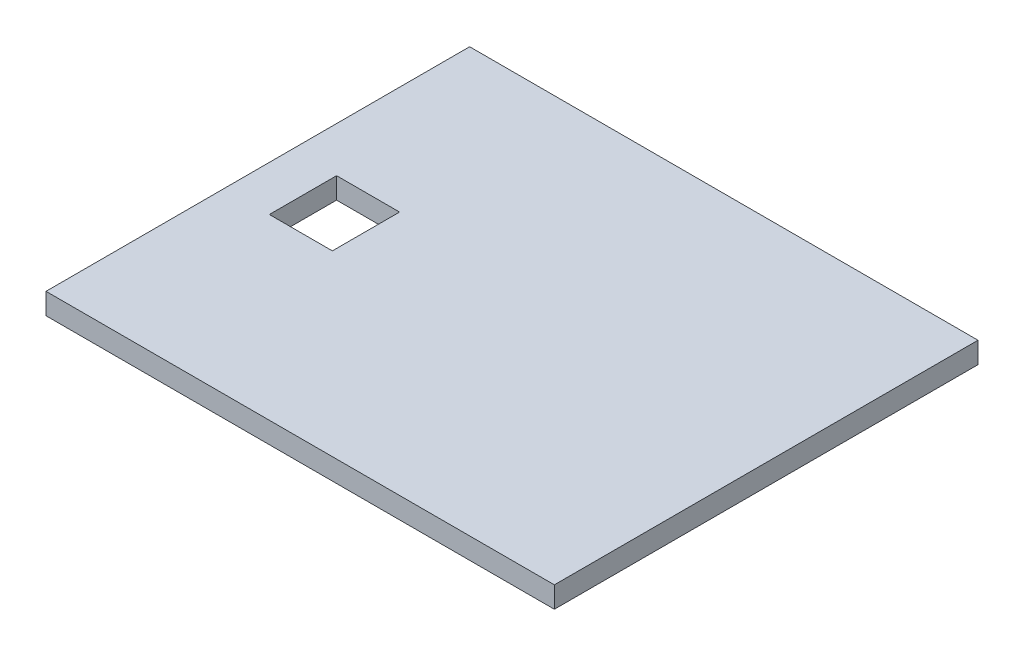
ISO-10303-21;
HEADER;
FILE_DESCRIPTION(('STEP AP214'),'2;1');
FILE_NAME('part.step','',(''),(''),'','','');
FILE_SCHEMA(('AUTOMOTIVE_DESIGN { 1 0 10303 214 1 1 1 1 }'));
ENDSEC;
DATA;
#1=APPLICATION_CONTEXT('core data for automotive mechanical design processes');
#2=APPLICATION_PROTOCOL_DEFINITION('international standard','automotive_design',2000,#1);
#3=PRODUCT_CONTEXT('',#1,'mechanical');
#4=PRODUCT('Part','Part','',(#3));
#5=PRODUCT_RELATED_PRODUCT_CATEGORY('part','',(#4));
#6=PRODUCT_DEFINITION_FORMATION('','',#4);
#7=PRODUCT_DEFINITION_CONTEXT('part definition',#1,'design');
#8=PRODUCT_DEFINITION('design','',#6,#7);
#9=PRODUCT_DEFINITION_SHAPE('','',#8);
#10=(LENGTH_UNIT() NAMED_UNIT(*) SI_UNIT(.MILLI.,.METRE.));
#11=(NAMED_UNIT(*) PLANE_ANGLE_UNIT() SI_UNIT($,.RADIAN.));
#12=(NAMED_UNIT(*) SI_UNIT($,.STERADIAN.) SOLID_ANGLE_UNIT());
#13=UNCERTAINTY_MEASURE_WITH_UNIT(LENGTH_MEASURE(1.E-05),#10,'distance_accuracy_value','');
#14=(GEOMETRIC_REPRESENTATION_CONTEXT(3) GLOBAL_UNCERTAINTY_ASSIGNED_CONTEXT((#13)) GLOBAL_UNIT_ASSIGNED_CONTEXT((#10,
#11,#12)) REPRESENTATION_CONTEXT('',''));
#15=CARTESIAN_POINT('',(0.,0.,0.));
#16=DIRECTION('',(0.,0.,1.));
#17=DIRECTION('',(1.,0.,0.));
#18=AXIS2_PLACEMENT_3D('',#15,#16,#17);
#19=CARTESIAN_POINT('',(0.,6.35,0.));
#20=DIRECTION('',(0.,1.,0.));
#21=DIRECTION('',(0.,0.,1.));
#22=AXIS2_PLACEMENT_3D('',#19,#20,#21);
#23=PLANE('',#22);
#24=DIRECTION('',(0.,0.,1.));
#25=VECTOR('',#24,1.);
#26=CARTESIAN_POINT('',(-76.2,6.35,63.5));
#27=LINE('',#26,#25);
#28=CARTESIAN_POINT('',(-76.2,6.35,-63.5));
#29=VERTEX_POINT('',#28);
#30=CARTESIAN_POINT('',(-76.2,6.35,63.5));
#31=VERTEX_POINT('',#30);
#32=EDGE_CURVE('E153',#29,#31,#27,.T.);
#33=ORIENTED_EDGE('',*,*,#32,.T.);
#34=DIRECTION('',(1.,0.,0.));
#35=VECTOR('',#34,1.);
#36=CARTESIAN_POINT('',(76.2,6.35,63.5));
#37=LINE('',#36,#35);
#38=CARTESIAN_POINT('',(76.2,6.35,63.5));
#39=VERTEX_POINT('',#38);
#40=EDGE_CURVE('E157',#31,#39,#37,.T.);
#41=ORIENTED_EDGE('',*,*,#40,.T.);
#42=DIRECTION('',(0.,0.,-1.));
#43=VECTOR('',#42,1.);
#44=CARTESIAN_POINT('',(76.2,6.35,63.5));
#45=LINE('',#44,#43);
#46=CARTESIAN_POINT('',(76.2,6.35,-63.5));
#47=VERTEX_POINT('',#46);
#48=EDGE_CURVE('E161',#39,#47,#45,.T.);
#49=ORIENTED_EDGE('',*,*,#48,.T.);
#50=DIRECTION('',(-1.,0.,0.));
#51=VECTOR('',#50,1.);
#52=CARTESIAN_POINT('',(76.2,6.35,-63.5));
#53=LINE('',#52,#51);
#54=EDGE_CURVE('E164',#47,#29,#53,.T.);
#55=ORIENTED_EDGE('',*,*,#54,.T.);
#56=EDGE_LOOP('',(#33,#41,#49,#55));
#57=FACE_BOUND('',#56,.T.);
#58=DIRECTION('',(1.,0.,0.));
#59=VECTOR('',#58,1.);
#60=CARTESIAN_POINT('',(-43.7781895242563,6.35,10.0762404488922));
#61=LINE('',#60,#59);
#62=CARTESIAN_POINT('',(-62.6647367629697,6.35,10.0762404488922));
#63=VERTEX_POINT('',#62);
#64=CARTESIAN_POINT('',(-43.7781895242563,6.35,10.0762404488922));
#65=VERTEX_POINT('',#64);
#66=EDGE_CURVE('E114',#63,#65,#61,.T.);
#67=ORIENTED_EDGE('',*,*,#66,.F.);
#68=DIRECTION('',(0.,0.,1.));
#69=VECTOR('',#68,1.);
#70=CARTESIAN_POINT('',(-62.6647367629697,6.35,10.0762404488922));
#71=LINE('',#70,#69);
#72=CARTESIAN_POINT('',(-62.6647367629697,6.35,-10.0762404488921));
#73=VERTEX_POINT('',#72);
#74=EDGE_CURVE('E105',#73,#63,#71,.T.);
#75=ORIENTED_EDGE('',*,*,#74,.F.);
#76=DIRECTION('',(-1.,0.,0.));
#77=VECTOR('',#76,1.);
#78=CARTESIAN_POINT('',(-43.7781895242563,6.35,-10.0762404488921));
#79=LINE('',#78,#77);
#80=CARTESIAN_POINT('',(-43.7781895242563,6.35,-10.0762404488921));
#81=VERTEX_POINT('',#80);
#82=EDGE_CURVE('E131',#81,#73,#79,.T.);
#83=ORIENTED_EDGE('',*,*,#82,.F.);
#84=DIRECTION('',(0.,0.,-1.));
#85=VECTOR('',#84,1.);
#86=CARTESIAN_POINT('',(-43.7781895242563,6.35,10.0762404488922));
#87=LINE('',#86,#85);
#88=EDGE_CURVE('E127',#65,#81,#87,.T.);
#89=ORIENTED_EDGE('',*,*,#88,.F.);
#90=EDGE_LOOP('',(#67,#75,#83,#89));
#91=FACE_BOUND('',#90,.T.);
#92=ADVANCED_FACE('F39',(#57,#91),#23,.T.);
#93=CARTESIAN_POINT('',(0.,0.,0.));
#94=DIRECTION('',(0.,1.,0.));
#95=DIRECTION('',(0.,0.,1.));
#96=AXIS2_PLACEMENT_3D('',#93,#94,#95);
#97=PLANE('',#96);
#98=DIRECTION('',(0.,0.,1.));
#99=VECTOR('',#98,1.);
#100=CARTESIAN_POINT('',(-76.2,0.,63.5));
#101=LINE('',#100,#99);
#102=CARTESIAN_POINT('',(-76.2,0.,-63.5));
#103=VERTEX_POINT('',#102);
#104=CARTESIAN_POINT('',(-76.2,0.,63.5));
#105=VERTEX_POINT('',#104);
#106=EDGE_CURVE('E123',#103,#105,#101,.T.);
#107=ORIENTED_EDGE('',*,*,#106,.F.);
#108=DIRECTION('',(-1.,0.,0.));
#109=VECTOR('',#108,1.);
#110=CARTESIAN_POINT('',(76.2,0.,-63.5));
#111=LINE('',#110,#109);
#112=CARTESIAN_POINT('',(76.2,0.,-63.5));
#113=VERTEX_POINT('',#112);
#114=EDGE_CURVE('E158',#113,#103,#111,.T.);
#115=ORIENTED_EDGE('',*,*,#114,.F.);
#116=DIRECTION('',(0.,0.,-1.));
#117=VECTOR('',#116,1.);
#118=CARTESIAN_POINT('',(76.2,0.,63.5));
#119=LINE('',#118,#117);
#120=CARTESIAN_POINT('',(76.2,0.,63.5));
#121=VERTEX_POINT('',#120);
#122=EDGE_CURVE('E174',#121,#113,#119,.T.);
#123=ORIENTED_EDGE('',*,*,#122,.F.);
#124=DIRECTION('',(1.,0.,0.));
#125=VECTOR('',#124,1.);
#126=CARTESIAN_POINT('',(76.2,0.,63.5));
#127=LINE('',#126,#125);
#128=EDGE_CURVE('E171',#105,#121,#127,.T.);
#129=ORIENTED_EDGE('',*,*,#128,.F.);
#130=EDGE_LOOP('',(#107,#115,#123,#129));
#131=FACE_BOUND('',#130,.T.);
#132=DIRECTION('',(0.,0.,1.));
#133=VECTOR('',#132,1.);
#134=CARTESIAN_POINT('',(-62.6647367629697,0.,10.0762404488922));
#135=LINE('',#134,#133);
#136=CARTESIAN_POINT('',(-62.6647367629697,0.,-10.0762404488921));
#137=VERTEX_POINT('',#136);
#138=CARTESIAN_POINT('',(-62.6647367629697,0.,10.0762404488922));
#139=VERTEX_POINT('',#138);
#140=EDGE_CURVE('E63',#137,#139,#135,.T.);
#141=ORIENTED_EDGE('',*,*,#140,.T.);
#142=DIRECTION('',(1.,0.,0.));
#143=VECTOR('',#142,1.);
#144=CARTESIAN_POINT('',(-43.7781895242563,0.,10.0762404488922));
#145=LINE('',#144,#143);
#146=CARTESIAN_POINT('',(-43.7781895242563,0.,10.0762404488922));
#147=VERTEX_POINT('',#146);
#148=EDGE_CURVE('E121',#139,#147,#145,.T.);
#149=ORIENTED_EDGE('',*,*,#148,.T.);
#150=DIRECTION('',(0.,0.,-1.));
#151=VECTOR('',#150,1.);
#152=CARTESIAN_POINT('',(-43.7781895242563,0.,10.0762404488922));
#153=LINE('',#152,#151);
#154=CARTESIAN_POINT('',(-43.7781895242563,0.,-10.0762404488921));
#155=VERTEX_POINT('',#154);
#156=EDGE_CURVE('E140',#147,#155,#153,.T.);
#157=ORIENTED_EDGE('',*,*,#156,.T.);
#158=DIRECTION('',(-1.,0.,0.));
#159=VECTOR('',#158,1.);
#160=CARTESIAN_POINT('',(-43.7781895242563,0.,-10.0762404488921));
#161=LINE('',#160,#159);
#162=EDGE_CURVE('E115',#155,#137,#161,.T.);
#163=ORIENTED_EDGE('',*,*,#162,.T.);
#164=EDGE_LOOP('',(#141,#149,#157,#163));
#165=FACE_BOUND('',#164,.T.);
#166=ADVANCED_FACE('F197',(#131,#165),#97,.F.);
#167=CARTESIAN_POINT('',(-76.2,6.35,63.5));
#168=DIRECTION('',(1.,0.,0.));
#169=DIRECTION('',(0.,0.,-1.));
#170=AXIS2_PLACEMENT_3D('',#167,#168,#169);
#171=PLANE('',#170);
#172=ORIENTED_EDGE('',*,*,#106,.T.);
#173=DIRECTION('',(0.,-1.,0.));
#174=VECTOR('',#173,1.);
#175=CARTESIAN_POINT('',(-76.2,6.35,63.5));
#176=LINE('',#175,#174);
#177=EDGE_CURVE('E11',#31,#105,#176,.T.);
#178=ORIENTED_EDGE('',*,*,#177,.F.);
#179=ORIENTED_EDGE('',*,*,#32,.F.);
#180=DIRECTION('',(0.,-1.,0.));
#181=VECTOR('',#180,1.);
#182=CARTESIAN_POINT('',(-76.2,6.35,-63.5));
#183=LINE('',#182,#181);
#184=EDGE_CURVE('E167',#29,#103,#183,.T.);
#185=ORIENTED_EDGE('',*,*,#184,.T.);
#186=EDGE_LOOP('',(#172,#178,#179,#185));
#187=FACE_BOUND('',#186,.T.);
#188=ADVANCED_FACE('F41',(#187),#171,.F.);
#189=CARTESIAN_POINT('',(76.2,6.35,63.5));
#190=DIRECTION('',(0.,0.,-1.));
#191=DIRECTION('',(-1.,0.,0.));
#192=AXIS2_PLACEMENT_3D('',#189,#190,#191);
#193=PLANE('',#192);
#194=ORIENTED_EDGE('',*,*,#128,.T.);
#195=DIRECTION('',(0.,-1.,0.));
#196=VECTOR('',#195,1.);
#197=CARTESIAN_POINT('',(76.2,6.35,63.5));
#198=LINE('',#197,#196);
#199=EDGE_CURVE('E48',#39,#121,#198,.T.);
#200=ORIENTED_EDGE('',*,*,#199,.F.);
#201=ORIENTED_EDGE('',*,*,#40,.F.);
#202=ORIENTED_EDGE('',*,*,#177,.T.);
#203=EDGE_LOOP('',(#194,#200,#201,#202));
#204=FACE_BOUND('',#203,.T.);
#205=ADVANCED_FACE('F207',(#204),#193,.F.);
#206=CARTESIAN_POINT('',(76.2,6.35,63.5));
#207=DIRECTION('',(-1.,0.,0.));
#208=DIRECTION('',(0.,0.,1.));
#209=AXIS2_PLACEMENT_3D('',#206,#207,#208);
#210=PLANE('',#209);
#211=ORIENTED_EDGE('',*,*,#122,.T.);
#212=DIRECTION('',(0.,-1.,0.));
#213=VECTOR('',#212,1.);
#214=CARTESIAN_POINT('',(76.2,6.35,-63.5));
#215=LINE('',#214,#213);
#216=EDGE_CURVE('E182',#47,#113,#215,.T.);
#217=ORIENTED_EDGE('',*,*,#216,.F.);
#218=ORIENTED_EDGE('',*,*,#48,.F.);
#219=ORIENTED_EDGE('',*,*,#199,.T.);
#220=EDGE_LOOP('',(#211,#217,#218,#219));
#221=FACE_BOUND('',#220,.T.);
#222=ADVANCED_FACE('F191',(#221),#210,.F.);
#223=CARTESIAN_POINT('',(76.2,6.35,-63.5));
#224=DIRECTION('',(0.,0.,1.));
#225=DIRECTION('',(1.,0.,0.));
#226=AXIS2_PLACEMENT_3D('',#223,#224,#225);
#227=PLANE('',#226);
#228=ORIENTED_EDGE('',*,*,#114,.T.);
#229=ORIENTED_EDGE('',*,*,#184,.F.);
#230=ORIENTED_EDGE('',*,*,#54,.F.);
#231=ORIENTED_EDGE('',*,*,#216,.T.);
#232=EDGE_LOOP('',(#228,#229,#230,#231));
#233=FACE_BOUND('',#232,.T.);
#234=ADVANCED_FACE('F201',(#233),#227,.F.);
#235=CARTESIAN_POINT('',(-62.6647367629697,6.35,10.0762404488922));
#236=DIRECTION('',(1.,0.,0.));
#237=DIRECTION('',(0.,0.,-1.));
#238=AXIS2_PLACEMENT_3D('',#235,#236,#237);
#239=PLANE('',#238);
#240=ORIENTED_EDGE('',*,*,#140,.F.);
#241=DIRECTION('',(0.,-1.,0.));
#242=VECTOR('',#241,1.);
#243=CARTESIAN_POINT('',(-62.6647367629697,6.35,-10.0762404488921));
#244=LINE('',#243,#242);
#245=EDGE_CURVE('E109',#73,#137,#244,.T.);
#246=ORIENTED_EDGE('',*,*,#245,.F.);
#247=ORIENTED_EDGE('',*,*,#74,.T.);
#248=DIRECTION('',(0.,-1.,0.));
#249=VECTOR('',#248,1.);
#250=CARTESIAN_POINT('',(-62.6647367629697,6.35,10.0762404488922));
#251=LINE('',#250,#249);
#252=EDGE_CURVE('E108',#63,#139,#251,.T.);
#253=ORIENTED_EDGE('',*,*,#252,.T.);
#254=EDGE_LOOP('',(#240,#246,#247,#253));
#255=FACE_BOUND('',#254,.T.);
#256=ADVANCED_FACE('F107',(#255),#239,.T.);
#257=CARTESIAN_POINT('',(-43.7781895242563,6.35,10.0762404488922));
#258=DIRECTION('',(0.,0.,-1.));
#259=DIRECTION('',(-1.,0.,0.));
#260=AXIS2_PLACEMENT_3D('',#257,#258,#259);
#261=PLANE('',#260);
#262=ORIENTED_EDGE('',*,*,#148,.F.);
#263=ORIENTED_EDGE('',*,*,#252,.F.);
#264=ORIENTED_EDGE('',*,*,#66,.T.);
#265=DIRECTION('',(0.,-1.,0.));
#266=VECTOR('',#265,1.);
#267=CARTESIAN_POINT('',(-43.7781895242563,6.35,10.0762404488922));
#268=LINE('',#267,#266);
#269=EDGE_CURVE('E124',#65,#147,#268,.T.);
#270=ORIENTED_EDGE('',*,*,#269,.T.);
#271=EDGE_LOOP('',(#262,#263,#264,#270));
#272=FACE_BOUND('',#271,.T.);
#273=ADVANCED_FACE('F118',(#272),#261,.T.);
#274=CARTESIAN_POINT('',(-43.7781895242563,6.35,10.0762404488922));
#275=DIRECTION('',(-1.,0.,0.));
#276=DIRECTION('',(0.,0.,1.));
#277=AXIS2_PLACEMENT_3D('',#274,#275,#276);
#278=PLANE('',#277);
#279=ORIENTED_EDGE('',*,*,#156,.F.);
#280=ORIENTED_EDGE('',*,*,#269,.F.);
#281=ORIENTED_EDGE('',*,*,#88,.T.);
#282=DIRECTION('',(0.,-1.,0.));
#283=VECTOR('',#282,1.);
#284=CARTESIAN_POINT('',(-43.7781895242563,6.35,-10.0762404488921));
#285=LINE('',#284,#283);
#286=EDGE_CURVE('E55',#81,#155,#285,.T.);
#287=ORIENTED_EDGE('',*,*,#286,.T.);
#288=EDGE_LOOP('',(#279,#280,#281,#287));
#289=FACE_BOUND('',#288,.T.);
#290=ADVANCED_FACE('F230',(#289),#278,.T.);
#291=CARTESIAN_POINT('',(-43.7781895242563,6.35,-10.0762404488921));
#292=DIRECTION('',(0.,0.,1.));
#293=DIRECTION('',(1.,0.,0.));
#294=AXIS2_PLACEMENT_3D('',#291,#292,#293);
#295=PLANE('',#294);
#296=ORIENTED_EDGE('',*,*,#162,.F.);
#297=ORIENTED_EDGE('',*,*,#286,.F.);
#298=ORIENTED_EDGE('',*,*,#82,.T.);
#299=ORIENTED_EDGE('',*,*,#245,.T.);
#300=EDGE_LOOP('',(#296,#297,#298,#299));
#301=FACE_BOUND('',#300,.T.);
#302=ADVANCED_FACE('F234',(#301),#295,.T.);
#303=CLOSED_SHELL('',(#92,#166,#188,#205,#222,#234,#256,#273,#290,#302));
#304=MANIFOLD_SOLID_BREP('B2',#303);
#305=ADVANCED_BREP_SHAPE_REPRESENTATION('',(#18,#304),#14);
#306=SHAPE_DEFINITION_REPRESENTATION(#9,#305);
ENDSEC;
END-ISO-10303-21;
